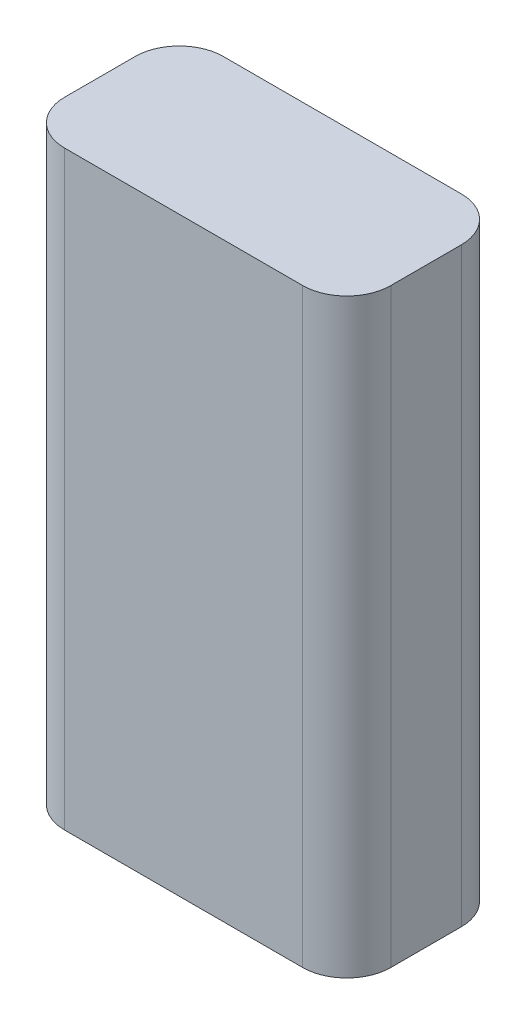
ISO-10303-21;
HEADER;
FILE_DESCRIPTION(('STEP AP214'),'2;1');
FILE_NAME('part.step','',(''),(''),'','','');
FILE_SCHEMA(('AUTOMOTIVE_DESIGN { 1 0 10303 214 1 1 1 1 }'));
ENDSEC;
DATA;
#1=APPLICATION_CONTEXT('core data for automotive mechanical design processes');
#2=APPLICATION_PROTOCOL_DEFINITION('international standard','automotive_design',2000,#1);
#3=PRODUCT_CONTEXT('',#1,'mechanical');
#4=PRODUCT('Part','Part','',(#3));
#5=PRODUCT_RELATED_PRODUCT_CATEGORY('part','',(#4));
#6=PRODUCT_DEFINITION_FORMATION('','',#4);
#7=PRODUCT_DEFINITION_CONTEXT('part definition',#1,'design');
#8=PRODUCT_DEFINITION('design','',#6,#7);
#9=PRODUCT_DEFINITION_SHAPE('','',#8);
#10=(LENGTH_UNIT() NAMED_UNIT(*) SI_UNIT(.MILLI.,.METRE.));
#11=(NAMED_UNIT(*) PLANE_ANGLE_UNIT() SI_UNIT($,.RADIAN.));
#12=(NAMED_UNIT(*) SI_UNIT($,.STERADIAN.) SOLID_ANGLE_UNIT());
#13=UNCERTAINTY_MEASURE_WITH_UNIT(LENGTH_MEASURE(1.E-05),#10,'distance_accuracy_value','');
#14=(GEOMETRIC_REPRESENTATION_CONTEXT(3) GLOBAL_UNCERTAINTY_ASSIGNED_CONTEXT((#13)) GLOBAL_UNIT_ASSIGNED_CONTEXT((#10,
#11,#12)) REPRESENTATION_CONTEXT('',''));
#15=CARTESIAN_POINT('',(0.,0.,0.));
#16=DIRECTION('',(0.,0.,1.));
#17=DIRECTION('',(1.,0.,0.));
#18=AXIS2_PLACEMENT_3D('',#15,#16,#17);
#19=CARTESIAN_POINT('',(18.5,-33.5,18.));
#20=DIRECTION('',(-1.,0.,0.));
#21=DIRECTION('',(0.,0.,1.));
#22=AXIS2_PLACEMENT_3D('',#19,#20,#21);
#23=PLANE('',#22);
#24=DIRECTION('',(0.,0.,-1.));
#25=VECTOR('',#24,1.);
#26=CARTESIAN_POINT('',(18.5,33.5,18.));
#27=LINE('',#26,#25);
#28=CARTESIAN_POINT('',(18.5,33.5,13.));
#29=VERTEX_POINT('',#28);
#30=CARTESIAN_POINT('',(18.5,33.5,5.));
#31=VERTEX_POINT('',#30);
#32=EDGE_CURVE('E149',#29,#31,#27,.T.);
#33=ORIENTED_EDGE('',*,*,#32,.F.);
#34=DIRECTION('',(0.,1.,0.));
#35=VECTOR('',#34,1.);
#36=CARTESIAN_POINT('',(18.5,-33.5,13.));
#37=LINE('',#36,#35);
#38=CARTESIAN_POINT('',(18.5,-33.5,13.));
#39=VERTEX_POINT('',#38);
#40=EDGE_CURVE('E110',#29,#39,#37,.F.);
#41=ORIENTED_EDGE('',*,*,#40,.T.);
#42=DIRECTION('',(0.,0.,-1.));
#43=VECTOR('',#42,1.);
#44=CARTESIAN_POINT('',(18.5,-33.5,18.));
#45=LINE('',#44,#43);
#46=CARTESIAN_POINT('',(18.5,-33.5,5.));
#47=VERTEX_POINT('',#46);
#48=EDGE_CURVE('E134',#39,#47,#45,.T.);
#49=ORIENTED_EDGE('',*,*,#48,.T.);
#50=DIRECTION('',(0.,1.,0.));
#51=VECTOR('',#50,1.);
#52=CARTESIAN_POINT('',(18.5,33.5,5.));
#53=LINE('',#52,#51);
#54=EDGE_CURVE('E115',#47,#31,#53,.T.);
#55=ORIENTED_EDGE('',*,*,#54,.T.);
#56=EDGE_LOOP('',(#33,#41,#49,#55));
#57=FACE_BOUND('',#56,.T.);
#58=ADVANCED_FACE('F39',(#57),#23,.F.);
#59=CARTESIAN_POINT('',(-18.5,33.5,18.));
#60=DIRECTION('',(0.,-1.,0.));
#61=DIRECTION('',(0.,0.,-1.));
#62=AXIS2_PLACEMENT_3D('',#59,#60,#61);
#63=PLANE('',#62);
#64=DIRECTION('',(-1.,0.,0.));
#65=VECTOR('',#64,1.);
#66=CARTESIAN_POINT('',(-18.5,33.5,18.));
#67=LINE('',#66,#65);
#68=CARTESIAN_POINT('',(13.5,33.5,18.));
#69=VERTEX_POINT('',#68);
#70=CARTESIAN_POINT('',(-13.5,33.5,18.));
#71=VERTEX_POINT('',#70);
#72=EDGE_CURVE('E123',#69,#71,#67,.T.);
#73=ORIENTED_EDGE('',*,*,#72,.F.);
#74=CARTESIAN_POINT('',(13.5,33.5,13.));
#75=DIRECTION('',(0.,-1.,0.));
#76=DIRECTION('',(0.,0.,-1.));
#77=AXIS2_PLACEMENT_3D('',#74,#75,#76);
#78=CIRCLE('',#77,5.);
#79=EDGE_CURVE('E105',#69,#29,#78,.F.);
#80=ORIENTED_EDGE('',*,*,#79,.T.);
#81=ORIENTED_EDGE('',*,*,#32,.T.);
#82=CARTESIAN_POINT('',(13.5,33.5,5.));
#83=DIRECTION('',(0.,-1.,0.));
#84=DIRECTION('',(0.,0.,-1.));
#85=AXIS2_PLACEMENT_3D('',#82,#83,#84);
#86=CIRCLE('',#85,5.);
#87=CARTESIAN_POINT('',(13.5,33.5,0.));
#88=VERTEX_POINT('',#87);
#89=EDGE_CURVE('E126',#31,#88,#86,.F.);
#90=ORIENTED_EDGE('',*,*,#89,.T.);
#91=DIRECTION('',(-1.,0.,0.));
#92=VECTOR('',#91,1.);
#93=CARTESIAN_POINT('',(-18.5,33.5,0.));
#94=LINE('',#93,#92);
#95=CARTESIAN_POINT('',(-13.5,33.5,0.));
#96=VERTEX_POINT('',#95);
#97=EDGE_CURVE('E137',#88,#96,#94,.T.);
#98=ORIENTED_EDGE('',*,*,#97,.T.);
#99=CARTESIAN_POINT('',(-13.5,33.5,5.));
#100=DIRECTION('',(0.,-1.,0.));
#101=DIRECTION('',(0.,0.,-1.));
#102=AXIS2_PLACEMENT_3D('',#99,#100,#101);
#103=CIRCLE('',#102,5.);
#104=CARTESIAN_POINT('',(-18.5,33.5,5.));
#105=VERTEX_POINT('',#104);
#106=EDGE_CURVE('E153',#96,#105,#103,.F.);
#107=ORIENTED_EDGE('',*,*,#106,.T.);
#108=DIRECTION('',(0.,0.,-1.));
#109=VECTOR('',#108,1.);
#110=CARTESIAN_POINT('',(-18.5,33.5,18.));
#111=LINE('',#110,#109);
#112=CARTESIAN_POINT('',(-18.5,33.5,13.));
#113=VERTEX_POINT('',#112);
#114=EDGE_CURVE('E146',#113,#105,#111,.T.);
#115=ORIENTED_EDGE('',*,*,#114,.F.);
#116=CARTESIAN_POINT('',(-13.5,33.5,13.));
#117=DIRECTION('',(0.,-1.,0.));
#118=DIRECTION('',(0.,0.,-1.));
#119=AXIS2_PLACEMENT_3D('',#116,#117,#118);
#120=CIRCLE('',#119,5.);
#121=EDGE_CURVE('E116',#113,#71,#120,.F.);
#122=ORIENTED_EDGE('',*,*,#121,.T.);
#123=EDGE_LOOP('',(#73,#80,#81,#90,#98,#107,#115,#122));
#124=FACE_BOUND('',#123,.T.);
#125=ADVANCED_FACE('F129',(#124),#63,.F.);
#126=CARTESIAN_POINT('',(-18.5,-33.5,18.));
#127=DIRECTION('',(1.,0.,0.));
#128=DIRECTION('',(0.,0.,-1.));
#129=AXIS2_PLACEMENT_3D('',#126,#127,#128);
#130=PLANE('',#129);
#131=DIRECTION('',(0.,0.,-1.));
#132=VECTOR('',#131,1.);
#133=CARTESIAN_POINT('',(-18.5,-33.5,18.));
#134=LINE('',#133,#132);
#135=CARTESIAN_POINT('',(-18.5,-33.5,13.));
#136=VERTEX_POINT('',#135);
#137=CARTESIAN_POINT('',(-18.5,-33.5,5.));
#138=VERTEX_POINT('',#137);
#139=EDGE_CURVE('E144',#136,#138,#134,.T.);
#140=ORIENTED_EDGE('',*,*,#139,.F.);
#141=DIRECTION('',(0.,-1.,0.));
#142=VECTOR('',#141,1.);
#143=CARTESIAN_POINT('',(-18.5,-33.5,13.));
#144=LINE('',#143,#142);
#145=EDGE_CURVE('E167',#136,#113,#144,.F.);
#146=ORIENTED_EDGE('',*,*,#145,.T.);
#147=ORIENTED_EDGE('',*,*,#114,.T.);
#148=DIRECTION('',(0.,-1.,0.));
#149=VECTOR('',#148,1.);
#150=CARTESIAN_POINT('',(-18.5,-33.5,5.));
#151=LINE('',#150,#149);
#152=EDGE_CURVE('E165',#105,#138,#151,.T.);
#153=ORIENTED_EDGE('',*,*,#152,.T.);
#154=EDGE_LOOP('',(#140,#146,#147,#153));
#155=FACE_BOUND('',#154,.T.);
#156=ADVANCED_FACE('F182',(#155),#130,.F.);
#157=CARTESIAN_POINT('',(-18.5,-33.5,18.));
#158=DIRECTION('',(0.,1.,0.));
#159=DIRECTION('',(0.,0.,1.));
#160=AXIS2_PLACEMENT_3D('',#157,#158,#159);
#161=PLANE('',#160);
#162=ORIENTED_EDGE('',*,*,#48,.F.);
#163=CARTESIAN_POINT('',(13.5,-33.5,13.));
#164=DIRECTION('',(0.,1.,0.));
#165=DIRECTION('',(0.,0.,1.));
#166=AXIS2_PLACEMENT_3D('',#163,#164,#165);
#167=CIRCLE('',#166,5.);
#168=CARTESIAN_POINT('',(13.5,-33.5,18.));
#169=VERTEX_POINT('',#168);
#170=EDGE_CURVE('E163',#39,#169,#167,.F.);
#171=ORIENTED_EDGE('',*,*,#170,.T.);
#172=DIRECTION('',(1.,0.,0.));
#173=VECTOR('',#172,1.);
#174=CARTESIAN_POINT('',(-18.5,-33.5,18.));
#175=LINE('',#174,#173);
#176=CARTESIAN_POINT('',(-13.5,-33.5,18.));
#177=VERTEX_POINT('',#176);
#178=EDGE_CURVE('E125',#177,#169,#175,.T.);
#179=ORIENTED_EDGE('',*,*,#178,.F.);
#180=CARTESIAN_POINT('',(-13.5,-33.5,13.));
#181=DIRECTION('',(0.,1.,0.));
#182=DIRECTION('',(0.,0.,1.));
#183=AXIS2_PLACEMENT_3D('',#180,#181,#182);
#184=CIRCLE('',#183,5.);
#185=EDGE_CURVE('E62',#177,#136,#184,.F.);
#186=ORIENTED_EDGE('',*,*,#185,.T.);
#187=ORIENTED_EDGE('',*,*,#139,.T.);
#188=CARTESIAN_POINT('',(-13.5,-33.5,5.));
#189=DIRECTION('',(0.,1.,0.));
#190=DIRECTION('',(0.,0.,1.));
#191=AXIS2_PLACEMENT_3D('',#188,#189,#190);
#192=CIRCLE('',#191,5.);
#193=CARTESIAN_POINT('',(-13.5,-33.5,0.));
#194=VERTEX_POINT('',#193);
#195=EDGE_CURVE('E54',#138,#194,#192,.F.);
#196=ORIENTED_EDGE('',*,*,#195,.T.);
#197=DIRECTION('',(1.,0.,0.));
#198=VECTOR('',#197,1.);
#199=CARTESIAN_POINT('',(-18.5,-33.5,0.));
#200=LINE('',#199,#198);
#201=CARTESIAN_POINT('',(13.5,-33.5,0.));
#202=VERTEX_POINT('',#201);
#203=EDGE_CURVE('E132',#194,#202,#200,.T.);
#204=ORIENTED_EDGE('',*,*,#203,.T.);
#205=CARTESIAN_POINT('',(13.5,-33.5,5.));
#206=DIRECTION('',(0.,1.,0.));
#207=DIRECTION('',(0.,0.,1.));
#208=AXIS2_PLACEMENT_3D('',#205,#206,#207);
#209=CIRCLE('',#208,5.);
#210=EDGE_CURVE('E159',#202,#47,#209,.F.);
#211=ORIENTED_EDGE('',*,*,#210,.T.);
#212=EDGE_LOOP('',(#162,#171,#179,#186,#187,#196,#204,#211));
#213=FACE_BOUND('',#212,.T.);
#214=ADVANCED_FACE('F176',(#213),#161,.F.);
#215=CARTESIAN_POINT('',(0.,0.,18.));
#216=DIRECTION('',(0.,0.,-1.));
#217=DIRECTION('',(-1.,0.,0.));
#218=AXIS2_PLACEMENT_3D('',#215,#216,#217);
#219=PLANE('',#218);
#220=ORIENTED_EDGE('',*,*,#178,.T.);
#221=DIRECTION('',(0.,1.,0.));
#222=VECTOR('',#221,1.);
#223=CARTESIAN_POINT('',(13.5,0.,18.));
#224=LINE('',#223,#222);
#225=EDGE_CURVE('E109',#169,#69,#224,.T.);
#226=ORIENTED_EDGE('',*,*,#225,.T.);
#227=ORIENTED_EDGE('',*,*,#72,.T.);
#228=DIRECTION('',(0.,-1.,0.));
#229=VECTOR('',#228,1.);
#230=CARTESIAN_POINT('',(-13.5,0.,18.));
#231=LINE('',#230,#229);
#232=EDGE_CURVE('E127',#71,#177,#231,.T.);
#233=ORIENTED_EDGE('',*,*,#232,.T.);
#234=EDGE_LOOP('',(#220,#226,#227,#233));
#235=FACE_BOUND('',#234,.T.);
#236=ADVANCED_FACE('F121',(#235),#219,.F.);
#237=CARTESIAN_POINT('',(0.,0.,0.));
#238=DIRECTION('',(0.,0.,-1.));
#239=DIRECTION('',(-1.,0.,0.));
#240=AXIS2_PLACEMENT_3D('',#237,#238,#239);
#241=PLANE('',#240);
#242=ORIENTED_EDGE('',*,*,#203,.F.);
#243=DIRECTION('',(0.,-1.,0.));
#244=VECTOR('',#243,1.);
#245=CARTESIAN_POINT('',(-13.5,33.5,0.));
#246=LINE('',#245,#244);
#247=EDGE_CURVE('E11',#194,#96,#246,.F.);
#248=ORIENTED_EDGE('',*,*,#247,.T.);
#249=ORIENTED_EDGE('',*,*,#97,.F.);
#250=DIRECTION('',(0.,1.,0.));
#251=VECTOR('',#250,1.);
#252=CARTESIAN_POINT('',(13.5,-33.5,0.));
#253=LINE('',#252,#251);
#254=EDGE_CURVE('E47',#88,#202,#253,.F.);
#255=ORIENTED_EDGE('',*,*,#254,.T.);
#256=EDGE_LOOP('',(#242,#248,#249,#255));
#257=FACE_BOUND('',#256,.T.);
#258=ADVANCED_FACE('F172',(#257),#241,.T.);
#259=CARTESIAN_POINT('',(13.5,0.,13.));
#260=DIRECTION('',(0.,1.,0.));
#261=DIRECTION('',(0.,0.,1.));
#262=AXIS2_PLACEMENT_3D('',#259,#260,#261);
#263=CYLINDRICAL_SURFACE('',#262,5.);
#264=ORIENTED_EDGE('',*,*,#170,.F.);
#265=ORIENTED_EDGE('',*,*,#40,.F.);
#266=ORIENTED_EDGE('',*,*,#79,.F.);
#267=ORIENTED_EDGE('',*,*,#225,.F.);
#268=EDGE_LOOP('',(#264,#265,#266,#267));
#269=FACE_BOUND('',#268,.T.);
#270=ADVANCED_FACE('F108',(#269),#263,.T.);
#271=CARTESIAN_POINT('',(-13.5,0.,13.));
#272=DIRECTION('',(0.,-1.,0.));
#273=DIRECTION('',(0.,0.,-1.));
#274=AXIS2_PLACEMENT_3D('',#271,#272,#273);
#275=CYLINDRICAL_SURFACE('',#274,5.);
#276=ORIENTED_EDGE('',*,*,#121,.F.);
#277=ORIENTED_EDGE('',*,*,#145,.F.);
#278=ORIENTED_EDGE('',*,*,#185,.F.);
#279=ORIENTED_EDGE('',*,*,#232,.F.);
#280=EDGE_LOOP('',(#276,#277,#278,#279));
#281=FACE_BOUND('',#280,.T.);
#282=ADVANCED_FACE('F185',(#281),#275,.T.);
#283=CARTESIAN_POINT('',(-13.5,-33.5,5.));
#284=DIRECTION('',(0.,1.,0.));
#285=DIRECTION('',(0.,0.,1.));
#286=AXIS2_PLACEMENT_3D('',#283,#284,#285);
#287=CYLINDRICAL_SURFACE('',#286,5.);
#288=ORIENTED_EDGE('',*,*,#106,.F.);
#289=ORIENTED_EDGE('',*,*,#247,.F.);
#290=ORIENTED_EDGE('',*,*,#195,.F.);
#291=ORIENTED_EDGE('',*,*,#152,.F.);
#292=EDGE_LOOP('',(#288,#289,#290,#291));
#293=FACE_BOUND('',#292,.T.);
#294=ADVANCED_FACE('F180',(#293),#287,.T.);
#295=CARTESIAN_POINT('',(13.5,-33.5,5.));
#296=DIRECTION('',(0.,-1.,0.));
#297=DIRECTION('',(0.,0.,-1.));
#298=AXIS2_PLACEMENT_3D('',#295,#296,#297);
#299=CYLINDRICAL_SURFACE('',#298,5.);
#300=ORIENTED_EDGE('',*,*,#210,.F.);
#301=ORIENTED_EDGE('',*,*,#254,.F.);
#302=ORIENTED_EDGE('',*,*,#89,.F.);
#303=ORIENTED_EDGE('',*,*,#54,.F.);
#304=EDGE_LOOP('',(#300,#301,#302,#303));
#305=FACE_BOUND('',#304,.T.);
#306=ADVANCED_FACE('F41',(#305),#299,.T.);
#307=CLOSED_SHELL('',(#58,#125,#156,#214,#236,#258,#270,#282,#294,#306));
#308=MANIFOLD_SOLID_BREP('B2',#307);
#309=ADVANCED_BREP_SHAPE_REPRESENTATION('',(#18,#308),#14);
#310=SHAPE_DEFINITION_REPRESENTATION(#9,#309);
ENDSEC;
END-ISO-10303-21;
